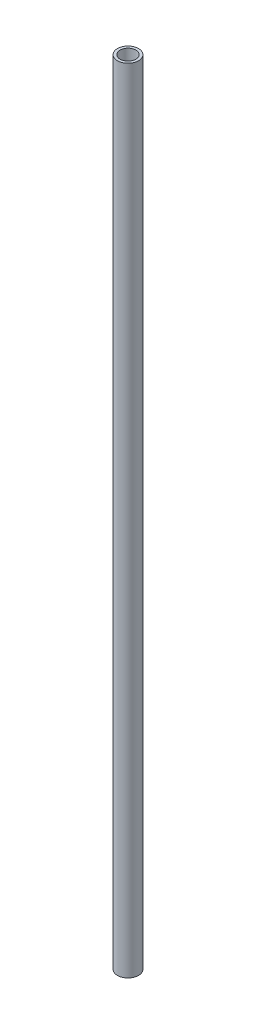
ISO-10303-21;
HEADER;
FILE_DESCRIPTION(('STEP AP214'),'2;1');
FILE_NAME('part.step','',(''),(''),'','','');
FILE_SCHEMA(('AUTOMOTIVE_DESIGN { 1 0 10303 214 1 1 1 1 }'));
ENDSEC;
DATA;
#1=APPLICATION_CONTEXT('core data for automotive mechanical design processes');
#2=APPLICATION_PROTOCOL_DEFINITION('international standard','automotive_design',2000,#1);
#3=PRODUCT_CONTEXT('',#1,'mechanical');
#4=PRODUCT('Part','Part','',(#3));
#5=PRODUCT_RELATED_PRODUCT_CATEGORY('part','',(#4));
#6=PRODUCT_DEFINITION_FORMATION('','',#4);
#7=PRODUCT_DEFINITION_CONTEXT('part definition',#1,'design');
#8=PRODUCT_DEFINITION('design','',#6,#7);
#9=PRODUCT_DEFINITION_SHAPE('','',#8);
#10=(LENGTH_UNIT() NAMED_UNIT(*) SI_UNIT(.MILLI.,.METRE.));
#11=(NAMED_UNIT(*) PLANE_ANGLE_UNIT() SI_UNIT($,.RADIAN.));
#12=(NAMED_UNIT(*) SI_UNIT($,.STERADIAN.) SOLID_ANGLE_UNIT());
#13=UNCERTAINTY_MEASURE_WITH_UNIT(LENGTH_MEASURE(1.E-05),#10,'distance_accuracy_value','');
#14=(GEOMETRIC_REPRESENTATION_CONTEXT(3) GLOBAL_UNCERTAINTY_ASSIGNED_CONTEXT((#13)) GLOBAL_UNIT_ASSIGNED_CONTEXT((#10,
#11,#12)) REPRESENTATION_CONTEXT('',''));
#15=CARTESIAN_POINT('',(0.,0.,0.));
#16=DIRECTION('',(0.,0.,1.));
#17=DIRECTION('',(1.,0.,0.));
#18=AXIS2_PLACEMENT_3D('',#15,#16,#17);
#19=CARTESIAN_POINT('',(0.,150.,0.));
#20=DIRECTION('',(0.,1.,0.));
#21=DIRECTION('',(0.,0.,1.));
#22=AXIS2_PLACEMENT_3D('',#19,#20,#21);
#23=PLANE('',#22);
#24=CARTESIAN_POINT('',(0.,150.,0.));
#25=DIRECTION('',(0.,1.,0.));
#26=DIRECTION('',(0.,0.,1.));
#27=AXIS2_PLACEMENT_3D('',#24,#25,#26);
#28=CIRCLE('',#27,2.);
#29=CARTESIAN_POINT('',(0.,150.,2.));
#30=VERTEX_POINT('',#29);
#31=EDGE_CURVE('E10',#30,#30,#28,.T.);
#32=ORIENTED_EDGE('',*,*,#31,.T.);
#33=EDGE_LOOP('',(#32));
#34=FACE_BOUND('',#33,.T.);
#35=CARTESIAN_POINT('',(0.,150.,0.));
#36=DIRECTION('',(0.,1.,0.));
#37=DIRECTION('',(0.,0.,1.));
#38=AXIS2_PLACEMENT_3D('',#35,#36,#37);
#39=CIRCLE('',#38,1.5);
#40=CARTESIAN_POINT('',(0.,150.,1.5));
#41=VERTEX_POINT('',#40);
#42=EDGE_CURVE('E42',#41,#41,#39,.T.);
#43=ORIENTED_EDGE('',*,*,#42,.F.);
#44=EDGE_LOOP('',(#43));
#45=FACE_BOUND('',#44,.T.);
#46=ADVANCED_FACE('F31',(#34,#45),#23,.T.);
#47=CARTESIAN_POINT('',(0.,0.,0.));
#48=DIRECTION('',(0.,1.,0.));
#49=DIRECTION('',(0.,0.,1.));
#50=AXIS2_PLACEMENT_3D('',#47,#48,#49);
#51=PLANE('',#50);
#52=CARTESIAN_POINT('',(0.,0.,0.));
#53=DIRECTION('',(0.,1.,0.));
#54=DIRECTION('',(0.,0.,1.));
#55=AXIS2_PLACEMENT_3D('',#52,#53,#54);
#56=CIRCLE('',#55,2.);
#57=CARTESIAN_POINT('',(0.,0.,2.));
#58=VERTEX_POINT('',#57);
#59=EDGE_CURVE('E35',#58,#58,#56,.T.);
#60=ORIENTED_EDGE('',*,*,#59,.F.);
#61=EDGE_LOOP('',(#60));
#62=FACE_BOUND('',#61,.T.);
#63=CARTESIAN_POINT('',(0.,0.,0.));
#64=DIRECTION('',(0.,1.,0.));
#65=DIRECTION('',(0.,0.,1.));
#66=AXIS2_PLACEMENT_3D('',#63,#64,#65);
#67=CIRCLE('',#66,1.5);
#68=CARTESIAN_POINT('',(0.,0.,1.5));
#69=VERTEX_POINT('',#68);
#70=EDGE_CURVE('E44',#69,#69,#67,.T.);
#71=ORIENTED_EDGE('',*,*,#70,.T.);
#72=EDGE_LOOP('',(#71));
#73=FACE_BOUND('',#72,.T.);
#74=ADVANCED_FACE('F54',(#62,#73),#51,.F.);
#75=CARTESIAN_POINT('',(0.,150.,0.));
#76=DIRECTION('',(0.,-1.,0.));
#77=DIRECTION('',(0.,0.,-1.));
#78=AXIS2_PLACEMENT_3D('',#75,#76,#77);
#79=CYLINDRICAL_SURFACE('',#78,2.);
#80=ORIENTED_EDGE('',*,*,#31,.F.);
#81=EDGE_LOOP('',(#80));
#82=FACE_BOUND('',#81,.T.);
#83=ORIENTED_EDGE('',*,*,#59,.T.);
#84=EDGE_LOOP('',(#83));
#85=FACE_BOUND('',#84,.T.);
#86=ADVANCED_FACE('F33',(#82,#85),#79,.T.);
#87=CARTESIAN_POINT('',(0.,150.,0.));
#88=DIRECTION('',(0.,-1.,0.));
#89=DIRECTION('',(0.,0.,-1.));
#90=AXIS2_PLACEMENT_3D('',#87,#88,#89);
#91=CYLINDRICAL_SURFACE('',#90,1.5);
#92=ORIENTED_EDGE('',*,*,#42,.T.);
#93=EDGE_LOOP('',(#92));
#94=FACE_BOUND('',#93,.T.);
#95=ORIENTED_EDGE('',*,*,#70,.F.);
#96=EDGE_LOOP('',(#95));
#97=FACE_BOUND('',#96,.T.);
#98=ADVANCED_FACE('F50',(#94,#97),#91,.F.);
#99=CLOSED_SHELL('',(#46,#74,#86,#98));
#100=MANIFOLD_SOLID_BREP('B2',#99);
#101=ADVANCED_BREP_SHAPE_REPRESENTATION('',(#18,#100),#14);
#102=SHAPE_DEFINITION_REPRESENTATION(#9,#101);
ENDSEC;
END-ISO-10303-21;
